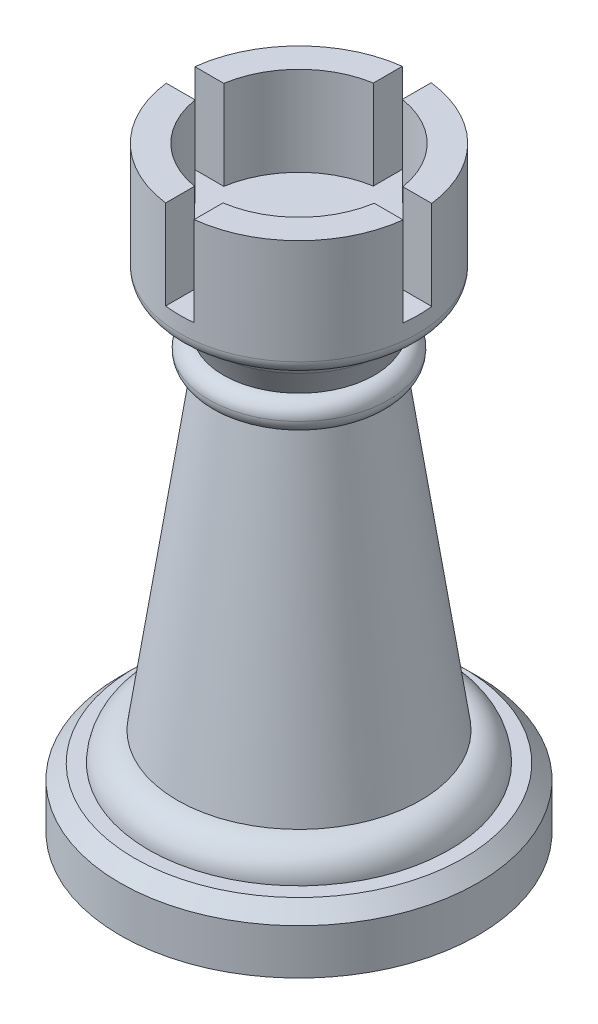
ISO-10303-21;
HEADER;
FILE_DESCRIPTION(('STEP AP214'),'2;1');
FILE_NAME('part.step','',(''),(''),'','','');
FILE_SCHEMA(('AUTOMOTIVE_DESIGN { 1 0 10303 214 1 1 1 1 }'));
ENDSEC;
DATA;
#1=APPLICATION_CONTEXT('core data for automotive mechanical design processes');
#2=APPLICATION_PROTOCOL_DEFINITION('international standard','automotive_design',2000,#1);
#3=PRODUCT_CONTEXT('',#1,'mechanical');
#4=PRODUCT('Part','Part','',(#3));
#5=PRODUCT_RELATED_PRODUCT_CATEGORY('part','',(#4));
#6=PRODUCT_DEFINITION_FORMATION('','',#4);
#7=PRODUCT_DEFINITION_CONTEXT('part definition',#1,'design');
#8=PRODUCT_DEFINITION('design','',#6,#7);
#9=PRODUCT_DEFINITION_SHAPE('','',#8);
#10=(LENGTH_UNIT() NAMED_UNIT(*) SI_UNIT(.MILLI.,.METRE.));
#11=(NAMED_UNIT(*) PLANE_ANGLE_UNIT() SI_UNIT($,.RADIAN.));
#12=(NAMED_UNIT(*) SI_UNIT($,.STERADIAN.) SOLID_ANGLE_UNIT());
#13=UNCERTAINTY_MEASURE_WITH_UNIT(LENGTH_MEASURE(1.E-05),#10,'distance_accuracy_value','');
#14=(GEOMETRIC_REPRESENTATION_CONTEXT(3) GLOBAL_UNCERTAINTY_ASSIGNED_CONTEXT((#13)) GLOBAL_UNIT_ASSIGNED_CONTEXT((#10,
#11,#12)) REPRESENTATION_CONTEXT('',''));
#15=CARTESIAN_POINT('',(0.,0.,0.));
#16=DIRECTION('',(0.,0.,1.));
#17=DIRECTION('',(1.,0.,0.));
#18=AXIS2_PLACEMENT_3D('',#15,#16,#17);
#19=CARTESIAN_POINT('',(-0.000284135877372561,24.6075293797934,0.));
#20=DIRECTION('',(0.,1.,0.));
#21=DIRECTION('',(0.,0.,1.));
#22=AXIS2_PLACEMENT_3D('',#19,#20,#21);
#23=PLANE('',#22);
#24=CARTESIAN_POINT('',(-0.000284135877372561,24.6075293797934,0.));
#25=DIRECTION('',(0.,1.,0.));
#26=DIRECTION('',(0.,0.,1.));
#27=AXIS2_PLACEMENT_3D('',#24,#25,#26);
#28=CIRCLE('',#27,7.5);
#29=CARTESIAN_POINT('',(7.44552005171714,24.6075293797934,-0.9));
#30=VERTEX_POINT('',#29);
#31=CARTESIAN_POINT('',(0.85583533168448,24.6075293797934,-7.45097708070972));
#32=VERTEX_POINT('',#31);
#33=EDGE_CURVE('E398',#30,#32,#28,.T.);
#34=ORIENTED_EDGE('',*,*,#33,.T.);
#35=DIRECTION('',(0.,0.,1.));
#36=VECTOR('',#35,1.);
#37=CARTESIAN_POINT('',(0.855835331684452,24.6075293797934,0.));
#38=LINE('',#37,#36);
#39=CARTESIAN_POINT('',(0.855835331684473,24.6075293797934,-5.63534022551093));
#40=VERTEX_POINT('',#39);
#41=EDGE_CURVE('E352',#32,#40,#38,.T.);
#42=ORIENTED_EDGE('',*,*,#41,.T.);
#43=CARTESIAN_POINT('',(-0.000284135877372561,24.6075293797934,0.));
#44=DIRECTION('',(0.,1.,0.));
#45=DIRECTION('',(0.,0.,1.));
#46=AXIS2_PLACEMENT_3D('',#43,#44,#45);
#47=CIRCLE('',#46,5.7);
#48=CARTESIAN_POINT('',(5.62821477591074,24.6075293797934,-0.9));
#49=VERTEX_POINT('',#48);
#50=EDGE_CURVE('E377',#49,#40,#47,.T.);
#51=ORIENTED_EDGE('',*,*,#50,.F.);
#52=DIRECTION('',(1.,0.,0.));
#53=VECTOR('',#52,1.);
#54=CARTESIAN_POINT('',(-0.000284135877372561,24.6075293797934,-0.9));
#55=LINE('',#54,#53);
#56=EDGE_CURVE('E329',#49,#30,#55,.T.);
#57=ORIENTED_EDGE('',*,*,#56,.T.);
#58=EDGE_LOOP('',(#34,#42,#51,#57));
#59=FACE_BOUND('',#58,.T.);
#60=ADVANCED_FACE('F170',(#59),#23,.T.);
#61=CARTESIAN_POINT('',(0.855835331684431,24.6075293797934,5.63534022551094));
#62=VERTEX_POINT('',#61);
#63=CARTESIAN_POINT('',(5.62821477591074,24.6075293797934,0.9));
#64=VERTEX_POINT('',#63);
#65=EDGE_CURVE('E374',#62,#64,#47,.T.);
#66=ORIENTED_EDGE('',*,*,#65,.F.);
#67=DIRECTION('',(0.,0.,1.));
#68=VECTOR('',#67,1.);
#69=CARTESIAN_POINT('',(0.855835331684452,24.6075293797934,0.));
#70=LINE('',#69,#68);
#71=CARTESIAN_POINT('',(0.855835331684424,24.6075293797934,7.45097708070973));
#72=VERTEX_POINT('',#71);
#73=EDGE_CURVE('E364',#62,#72,#70,.T.);
#74=ORIENTED_EDGE('',*,*,#73,.T.);
#75=CARTESIAN_POINT('',(7.44552005171714,24.6075293797934,0.9));
#76=VERTEX_POINT('',#75);
#77=EDGE_CURVE('E394',#72,#76,#28,.T.);
#78=ORIENTED_EDGE('',*,*,#77,.T.);
#79=DIRECTION('',(1.,0.,0.));
#80=VECTOR('',#79,1.);
#81=CARTESIAN_POINT('',(-0.000284135877372558,24.6075293797934,0.9));
#82=LINE('',#81,#80);
#83=EDGE_CURVE('E335',#64,#76,#82,.T.);
#84=ORIENTED_EDGE('',*,*,#83,.F.);
#85=EDGE_LOOP('',(#66,#74,#78,#84));
#86=FACE_BOUND('',#85,.T.);
#87=ADVANCED_FACE('F454',(#86),#23,.T.);
#88=CARTESIAN_POINT('',(-0.94416466831552,24.6075293797934,-7.44036891158525));
#89=VERTEX_POINT('',#88);
#90=CARTESIAN_POINT('',(-7.44608832347189,24.6075293797934,-0.9));
#91=VERTEX_POINT('',#90);
#92=EDGE_CURVE('E819',#89,#91,#28,.T.);
#93=ORIENTED_EDGE('',*,*,#92,.T.);
#94=DIRECTION('',(1.,0.,0.));
#95=VECTOR('',#94,1.);
#96=CARTESIAN_POINT('',(-0.000284135877372561,24.6075293797934,-0.9));
#97=LINE('',#96,#95);
#98=CARTESIAN_POINT('',(-5.62878304766549,24.6075293797934,-0.9));
#99=VERTEX_POINT('',#98);
#100=EDGE_CURVE('E312',#91,#99,#97,.T.);
#101=ORIENTED_EDGE('',*,*,#100,.T.);
#102=CARTESIAN_POINT('',(-0.944164668315527,24.6075293797934,-5.62130674669905));
#103=VERTEX_POINT('',#102);
#104=EDGE_CURVE('E289',#103,#99,#47,.T.);
#105=ORIENTED_EDGE('',*,*,#104,.F.);
#106=DIRECTION('',(0.,0.,1.));
#107=VECTOR('',#106,1.);
#108=CARTESIAN_POINT('',(-0.944164668315548,24.6075293797934,0.));
#109=LINE('',#108,#107);
#110=EDGE_CURVE('E349',#89,#103,#109,.T.);
#111=ORIENTED_EDGE('',*,*,#110,.F.);
#112=EDGE_LOOP('',(#93,#101,#105,#111));
#113=FACE_BOUND('',#112,.T.);
#114=ADVANCED_FACE('F456',(#113),#23,.T.);
#115=CARTESIAN_POINT('',(-0.000284135877372561,24.6075293797934,0.));
#116=DIRECTION('',(0.,1.,0.));
#117=DIRECTION('',(0.,0.,1.));
#118=AXIS2_PLACEMENT_3D('',#115,#116,#117);
#119=CYLINDRICAL_SURFACE('',#118,7.5);
#120=DIRECTION('',(0.,1.,0.));
#121=VECTOR('',#120,1.);
#122=CARTESIAN_POINT('',(-7.44608832347189,18.9975293797934,0.9));
#123=LINE('',#122,#121);
#124=CARTESIAN_POINT('',(-7.44608832347189,18.9975293797934,0.9));
#125=VERTEX_POINT('',#124);
#126=CARTESIAN_POINT('',(-7.44608832347189,24.6075293797934,0.9));
#127=VERTEX_POINT('',#126);
#128=EDGE_CURVE('E322',#125,#127,#123,.T.);
#129=ORIENTED_EDGE('',*,*,#128,.F.);
#130=CARTESIAN_POINT('',(-0.000284135877372561,18.9975293797934,0.));
#131=DIRECTION('',(0.,1.,0.));
#132=DIRECTION('',(0.,0.,1.));
#133=AXIS2_PLACEMENT_3D('',#130,#131,#132);
#134=CIRCLE('',#133,7.5);
#135=CARTESIAN_POINT('',(-7.44608832347189,18.9975293797934,-0.9));
#136=VERTEX_POINT('',#135);
#137=EDGE_CURVE('E307',#136,#125,#134,.T.);
#138=ORIENTED_EDGE('',*,*,#137,.F.);
#139=DIRECTION('',(0.,1.,0.));
#140=VECTOR('',#139,1.);
#141=CARTESIAN_POINT('',(-7.44608832347189,18.9975293797934,-0.9));
#142=LINE('',#141,#140);
#143=EDGE_CURVE('E293',#136,#91,#142,.T.);
#144=ORIENTED_EDGE('',*,*,#143,.T.);
#145=ORIENTED_EDGE('',*,*,#92,.F.);
#146=DIRECTION('',(0.,1.,0.));
#147=VECTOR('',#146,1.);
#148=CARTESIAN_POINT('',(-0.94416466831552,24.6075293797934,-7.44036891158525));
#149=LINE('',#148,#147);
#150=CARTESIAN_POINT('',(-0.94416466831552,18.9975293797934,-7.44036891158525));
#151=VERTEX_POINT('',#150);
#152=EDGE_CURVE('E422',#151,#89,#149,.T.);
#153=ORIENTED_EDGE('',*,*,#152,.F.);
#154=CARTESIAN_POINT('',(-0.000284135877372561,18.9975293797934,0.));
#155=DIRECTION('',(0.,1.,0.));
#156=DIRECTION('',(0.,0.,1.));
#157=AXIS2_PLACEMENT_3D('',#154,#155,#156);
#158=CIRCLE('',#157,7.5);
#159=CARTESIAN_POINT('',(0.85583533168448,18.9975293797934,-7.45097708070972));
#160=VERTEX_POINT('',#159);
#161=EDGE_CURVE('E424',#151,#160,#158,.F.);
#162=ORIENTED_EDGE('',*,*,#161,.T.);
#163=DIRECTION('',(0.,1.,0.));
#164=VECTOR('',#163,1.);
#165=CARTESIAN_POINT('',(0.85583533168448,24.6075293797934,-7.45097708070972));
#166=LINE('',#165,#164);
#167=EDGE_CURVE('E427',#160,#32,#166,.T.);
#168=ORIENTED_EDGE('',*,*,#167,.T.);
#169=ORIENTED_EDGE('',*,*,#33,.F.);
#170=DIRECTION('',(0.,1.,0.));
#171=VECTOR('',#170,1.);
#172=CARTESIAN_POINT('',(7.44552005171714,18.9975293797934,-0.9));
#173=LINE('',#172,#171);
#174=CARTESIAN_POINT('',(7.44552005171714,18.9975293797934,-0.9));
#175=VERTEX_POINT('',#174);
#176=EDGE_CURVE('E341',#175,#30,#173,.T.);
#177=ORIENTED_EDGE('',*,*,#176,.F.);
#178=CARTESIAN_POINT('',(-0.000284135877372561,18.9975293797934,0.));
#179=DIRECTION('',(0.,1.,0.));
#180=DIRECTION('',(0.,0.,1.));
#181=AXIS2_PLACEMENT_3D('',#178,#179,#180);
#182=CIRCLE('',#181,7.5);
#183=CARTESIAN_POINT('',(7.44552005171714,18.9975293797934,0.9));
#184=VERTEX_POINT('',#183);
#185=EDGE_CURVE('E328',#184,#175,#182,.T.);
#186=ORIENTED_EDGE('',*,*,#185,.F.);
#187=DIRECTION('',(0.,1.,0.));
#188=VECTOR('',#187,1.);
#189=CARTESIAN_POINT('',(7.44552005171714,18.9975293797934,0.9));
#190=LINE('',#189,#188);
#191=EDGE_CURVE('E343',#184,#76,#190,.T.);
#192=ORIENTED_EDGE('',*,*,#191,.T.);
#193=ORIENTED_EDGE('',*,*,#77,.F.);
#194=DIRECTION('',(0.,1.,0.));
#195=VECTOR('',#194,1.);
#196=CARTESIAN_POINT('',(0.855835331684424,24.6075293797934,7.45097708070973));
#197=LINE('',#196,#195);
#198=CARTESIAN_POINT('',(0.855835331684424,18.9975293797934,7.45097708070973));
#199=VERTEX_POINT('',#198);
#200=EDGE_CURVE('E12',#72,#199,#197,.F.);
#201=ORIENTED_EDGE('',*,*,#200,.T.);
#202=CARTESIAN_POINT('',(-0.944164668315575,18.9975293797934,7.44036891158524));
#203=VERTEX_POINT('',#202);
#204=EDGE_CURVE('E178',#199,#203,#158,.F.);
#205=ORIENTED_EDGE('',*,*,#204,.T.);
#206=DIRECTION('',(0.,1.,0.));
#207=VECTOR('',#206,1.);
#208=CARTESIAN_POINT('',(-0.944164668315575,24.6075293797934,7.44036891158524));
#209=LINE('',#208,#207);
#210=CARTESIAN_POINT('',(-0.944164668315575,24.6075293797934,7.44036891158524));
#211=VERTEX_POINT('',#210);
#212=EDGE_CURVE('E429',#211,#203,#209,.F.);
#213=ORIENTED_EDGE('',*,*,#212,.F.);
#214=EDGE_CURVE('E393',#127,#211,#28,.T.);
#215=ORIENTED_EDGE('',*,*,#214,.F.);
#216=EDGE_LOOP('',(#129,#138,#144,#145,#153,#162,#168,#169,#177,#186,#192,#193,#201,#205,#213,#215));
#217=FACE_BOUND('',#216,.T.);
#218=CARTESIAN_POINT('',(-0.000284135877372561,18.0075293797934,0.));
#219=DIRECTION('',(0.,1.,0.));
#220=DIRECTION('',(0.,0.,1.));
#221=AXIS2_PLACEMENT_3D('',#218,#219,#220);
#222=CIRCLE('',#221,7.5);
#223=CARTESIAN_POINT('',(-0.000284135877372561,18.0075293797934,7.5));
#224=VERTEX_POINT('',#223);
#225=EDGE_CURVE('E410',#224,#224,#222,.T.);
#226=ORIENTED_EDGE('',*,*,#225,.T.);
#227=EDGE_LOOP('',(#226));
#228=FACE_BOUND('',#227,.T.);
#229=ADVANCED_FACE('F436',(#217,#228),#119,.T.);
#230=DIRECTION('',(1.,0.,0.));
#231=VECTOR('',#230,1.);
#232=CARTESIAN_POINT('',(-0.000284135877372558,24.6075293797934,0.9));
#233=LINE('',#232,#231);
#234=CARTESIAN_POINT('',(-5.62878304766549,24.6075293797934,0.9));
#235=VERTEX_POINT('',#234);
#236=EDGE_CURVE('E308',#127,#235,#233,.T.);
#237=ORIENTED_EDGE('',*,*,#236,.F.);
#238=ORIENTED_EDGE('',*,*,#214,.T.);
#239=DIRECTION('',(0.,0.,1.));
#240=VECTOR('',#239,1.);
#241=CARTESIAN_POINT('',(-0.944164668315548,24.6075293797934,0.));
#242=LINE('',#241,#240);
#243=CARTESIAN_POINT('',(-0.944164668315569,24.6075293797934,5.62130674669904));
#244=VERTEX_POINT('',#243);
#245=EDGE_CURVE('E367',#244,#211,#242,.T.);
#246=ORIENTED_EDGE('',*,*,#245,.F.);
#247=EDGE_CURVE('E378',#235,#244,#47,.T.);
#248=ORIENTED_EDGE('',*,*,#247,.F.);
#249=EDGE_LOOP('',(#237,#238,#246,#248));
#250=FACE_BOUND('',#249,.T.);
#251=ADVANCED_FACE('F463',(#250),#23,.T.);
#252=CARTESIAN_POINT('',(-0.000284135877372561,16.2075293797934,0.));
#253=DIRECTION('',(0.,1.,0.));
#254=DIRECTION('',(0.,0.,1.));
#255=AXIS2_PLACEMENT_3D('',#252,#253,#254);
#256=CONICAL_SURFACE('',#255,5.7,0.476467419473706);
#257=CARTESIAN_POINT('',(-0.000284135877372561,16.0480018990106,0.));
#258=DIRECTION('',(0.,1.,0.));
#259=DIRECTION('',(0.,0.,1.));
#260=AXIS2_PLACEMENT_3D('',#257,#258,#259);
#261=CIRCLE('',#260,5.61766323572501);
#262=CARTESIAN_POINT('',(-0.000284135877372561,16.0480018990106,5.61766323572501));
#263=VERTEX_POINT('',#262);
#264=EDGE_CURVE('E419',#263,#263,#261,.F.);
#265=ORIENTED_EDGE('',*,*,#264,.T.);
#266=EDGE_LOOP('',(#265));
#267=FACE_BOUND('',#266,.T.);
#268=CARTESIAN_POINT('',(-0.000284135877372561,14.3475293797934,0.));
#269=DIRECTION('',(0.,1.,0.));
#270=DIRECTION('',(0.,0.,1.));
#271=AXIS2_PLACEMENT_3D('',#268,#269,#270);
#272=CIRCLE('',#271,4.74);
#273=CARTESIAN_POINT('',(-0.000284135877372561,14.3475293797934,4.74));
#274=VERTEX_POINT('',#273);
#275=EDGE_CURVE('E390',#274,#274,#272,.T.);
#276=ORIENTED_EDGE('',*,*,#275,.T.);
#277=EDGE_LOOP('',(#276));
#278=FACE_BOUND('',#277,.T.);
#279=ADVANCED_FACE('F468',(#267,#278),#256,.T.);
#280=CARTESIAN_POINT('',(-0.000284135877372561,24.6075293797934,0.));
#281=DIRECTION('',(0.,1.,0.));
#282=DIRECTION('',(0.,0.,1.));
#283=AXIS2_PLACEMENT_3D('',#280,#281,#282);
#284=CYLINDRICAL_SURFACE('',#283,5.64);
#285=CARTESIAN_POINT('',(-0.000284135877372561,13.4470292408273,0.));
#286=DIRECTION('',(0.,-1.,0.));
#287=DIRECTION('',(0.,0.,-1.));
#288=AXIS2_PLACEMENT_3D('',#285,#286,#287);
#289=CIRCLE('',#288,5.64);
#290=CARTESIAN_POINT('',(-0.000284135877372561,13.4470292408273,-5.64));
#291=VERTEX_POINT('',#290);
#292=EDGE_CURVE('E407',#291,#291,#289,.F.);
#293=ORIENTED_EDGE('',*,*,#292,.T.);
#294=EDGE_LOOP('',(#293));
#295=FACE_BOUND('',#294,.T.);
#296=CARTESIAN_POINT('',(-0.000284135877372561,13.4475293797934,0.));
#297=DIRECTION('',(0.,1.,0.));
#298=DIRECTION('',(0.,0.,1.));
#299=AXIS2_PLACEMENT_3D('',#296,#297,#298);
#300=CIRCLE('',#299,5.64);
#301=CARTESIAN_POINT('',(-0.000284135877372561,13.4475293797934,5.64));
#302=VERTEX_POINT('',#301);
#303=EDGE_CURVE('E404',#302,#302,#300,.F.);
#304=ORIENTED_EDGE('',*,*,#303,.T.);
#305=EDGE_LOOP('',(#304));
#306=FACE_BOUND('',#305,.T.);
#307=ADVANCED_FACE('F519',(#295,#306),#284,.T.);
#308=CARTESIAN_POINT('',(-0.000284135877372561,-7.34247062020662,0.));
#309=DIRECTION('',(0.,-1.,0.));
#310=DIRECTION('',(0.,0.,-1.));
#311=AXIS2_PLACEMENT_3D('',#308,#309,#310);
#312=CONICAL_SURFACE('',#311,7.65,0.143796988986842);
#313=CARTESIAN_POINT('',(-0.000284135877372561,12.5475293797934,0.));
#314=DIRECTION('',(0.,1.,0.));
#315=DIRECTION('',(0.,0.,1.));
#316=AXIS2_PLACEMENT_3D('',#313,#314,#315);
#317=CIRCLE('',#316,4.77);
#318=CARTESIAN_POINT('',(-0.000284135877372561,12.5475293797934,4.77));
#319=VERTEX_POINT('',#318);
#320=EDGE_CURVE('E387',#319,#319,#317,.T.);
#321=ORIENTED_EDGE('',*,*,#320,.F.);
#322=EDGE_LOOP('',(#321));
#323=FACE_BOUND('',#322,.T.);
#324=CARTESIAN_POINT('',(-0.000284135877372561,-7.34247062020662,0.));
#325=DIRECTION('',(0.,1.,0.));
#326=DIRECTION('',(0.,0.,1.));
#327=AXIS2_PLACEMENT_3D('',#324,#325,#326);
#328=CIRCLE('',#327,7.65);
#329=CARTESIAN_POINT('',(-0.000284135877372561,-7.34247062020662,7.65));
#330=VERTEX_POINT('',#329);
#331=EDGE_CURVE('E384',#330,#330,#328,.T.);
#332=ORIENTED_EDGE('',*,*,#331,.T.);
#333=EDGE_LOOP('',(#332));
#334=FACE_BOUND('',#333,.T.);
#335=ADVANCED_FACE('F526',(#323,#334),#312,.T.);
#336=CARTESIAN_POINT('',(-0.000284135877372561,-9.14247062020662,0.));
#337=DIRECTION('',(0.,1.,0.));
#338=DIRECTION('',(0.,0.,1.));
#339=AXIS2_PLACEMENT_3D('',#336,#337,#338);
#340=PLANE('',#339);
#341=CARTESIAN_POINT('',(-0.000284135877372561,-9.14247062020662,0.));
#342=DIRECTION('',(0.,1.,0.));
#343=DIRECTION('',(0.,0.,1.));
#344=AXIS2_PLACEMENT_3D('',#341,#342,#343);
#345=CIRCLE('',#344,10.35);
#346=CARTESIAN_POINT('',(-0.000284135877372561,-9.14247062020662,10.35));
#347=VERTEX_POINT('',#346);
#348=EDGE_CURVE('E397',#347,#347,#345,.T.);
#349=ORIENTED_EDGE('',*,*,#348,.T.);
#350=EDGE_LOOP('',(#349));
#351=FACE_BOUND('',#350,.T.);
#352=CARTESIAN_POINT('',(-0.000284135877372561,-9.14247062020662,0.));
#353=DIRECTION('',(0.,1.,0.));
#354=DIRECTION('',(0.,0.,1.));
#355=AXIS2_PLACEMENT_3D('',#352,#353,#354);
#356=CIRCLE('',#355,9.45);
#357=CARTESIAN_POINT('',(-0.000284135877372561,-9.14247062020662,9.45));
#358=VERTEX_POINT('',#357);
#359=EDGE_CURVE('E381',#358,#358,#356,.T.);
#360=ORIENTED_EDGE('',*,*,#359,.F.);
#361=EDGE_LOOP('',(#360));
#362=FACE_BOUND('',#361,.T.);
#363=ADVANCED_FACE('F534',(#351,#362),#340,.T.);
#364=CARTESIAN_POINT('',(-0.000284135877372561,24.6075293797934,0.));
#365=DIRECTION('',(0.,1.,0.));
#366=DIRECTION('',(0.,0.,1.));
#367=AXIS2_PLACEMENT_3D('',#364,#365,#366);
#368=CYLINDRICAL_SURFACE('',#367,11.25);
#369=CARTESIAN_POINT('',(-0.000284135877372561,-10.0424706202066,0.));
#370=DIRECTION('',(0.,1.,0.));
#371=DIRECTION('',(0.,0.,1.));
#372=AXIS2_PLACEMENT_3D('',#369,#370,#371);
#373=CIRCLE('',#372,11.25);
#374=CARTESIAN_POINT('',(-0.000284135877372561,-10.0424706202066,11.25));
#375=VERTEX_POINT('',#374);
#376=EDGE_CURVE('E401',#375,#375,#373,.F.);
#377=ORIENTED_EDGE('',*,*,#376,.T.);
#378=EDGE_LOOP('',(#377));
#379=FACE_BOUND('',#378,.T.);
#380=CARTESIAN_POINT('',(-0.000284135877372561,-12.8924706202066,0.));
#381=DIRECTION('',(0.,1.,0.));
#382=DIRECTION('',(0.,0.,1.));
#383=AXIS2_PLACEMENT_3D('',#380,#381,#382);
#384=CIRCLE('',#383,11.25);
#385=CARTESIAN_POINT('',(-0.000284135877372561,-12.8924706202066,11.25));
#386=VERTEX_POINT('',#385);
#387=EDGE_CURVE('E321',#386,#386,#384,.T.);
#388=ORIENTED_EDGE('',*,*,#387,.T.);
#389=EDGE_LOOP('',(#388));
#390=FACE_BOUND('',#389,.T.);
#391=ADVANCED_FACE('F542',(#379,#390),#368,.T.);
#392=CARTESIAN_POINT('',(-0.000284135877372561,-12.8924706202066,0.));
#393=DIRECTION('',(0.,1.,0.));
#394=DIRECTION('',(0.,0.,1.));
#395=AXIS2_PLACEMENT_3D('',#392,#393,#394);
#396=PLANE('',#395);
#397=ORIENTED_EDGE('',*,*,#387,.F.);
#398=EDGE_LOOP('',(#397));
#399=FACE_BOUND('',#398,.T.);
#400=ADVANCED_FACE('F475',(#399),#396,.F.);
#401=CARTESIAN_POINT('',(-0.000284135877372561,-9.14247062020662,0.));
#402=DIRECTION('',(0.,-1.,0.));
#403=DIRECTION('',(0.,0.,-1.));
#404=AXIS2_PLACEMENT_3D('',#401,#402,#403);
#405=CONICAL_SURFACE('',#404,10.35,0.78539816339745);
#406=ORIENTED_EDGE('',*,*,#376,.F.);
#407=EDGE_LOOP('',(#406));
#408=FACE_BOUND('',#407,.T.);
#409=ORIENTED_EDGE('',*,*,#348,.F.);
#410=EDGE_LOOP('',(#409));
#411=FACE_BOUND('',#410,.T.);
#412=ADVANCED_FACE('F471',(#408,#411),#405,.T.);
#413=CARTESIAN_POINT('',(-0.000284135877372561,-9.14247062020662,0.));
#414=DIRECTION('',(0.,1.,0.));
#415=DIRECTION('',(0.,0.,1.));
#416=AXIS2_PLACEMENT_3D('',#413,#414,#415);
#417=TOROIDAL_SURFACE('',#416,7.65,1.8);
#418=ORIENTED_EDGE('',*,*,#359,.T.);
#419=EDGE_LOOP('',(#418));
#420=FACE_BOUND('',#419,.T.);
#421=ORIENTED_EDGE('',*,*,#331,.F.);
#422=EDGE_LOOP('',(#421));
#423=FACE_BOUND('',#422,.T.);
#424=ADVANCED_FACE('F474',(#420,#423),#417,.T.);
#425=CARTESIAN_POINT('',(-0.000284135877372561,13.4470292408273,0.));
#426=DIRECTION('',(0.,-1.,0.));
#427=DIRECTION('',(0.,0.,-1.));
#428=AXIS2_PLACEMENT_3D('',#425,#426,#427);
#429=TOROIDAL_SURFACE('',#428,4.74,0.9);
#430=ORIENTED_EDGE('',*,*,#320,.T.);
#431=EDGE_LOOP('',(#430));
#432=FACE_BOUND('',#431,.T.);
#433=ORIENTED_EDGE('',*,*,#292,.F.);
#434=EDGE_LOOP('',(#433));
#435=FACE_BOUND('',#434,.T.);
#436=ADVANCED_FACE('F479',(#432,#435),#429,.T.);
#437=CARTESIAN_POINT('',(-0.000284135877372561,13.4475293797934,0.));
#438=DIRECTION('',(0.,1.,0.));
#439=DIRECTION('',(0.,0.,1.));
#440=AXIS2_PLACEMENT_3D('',#437,#438,#439);
#441=TOROIDAL_SURFACE('',#440,4.74,0.9);
#442=ORIENTED_EDGE('',*,*,#303,.F.);
#443=EDGE_LOOP('',(#442));
#444=FACE_BOUND('',#443,.T.);
#445=ORIENTED_EDGE('',*,*,#275,.F.);
#446=EDGE_LOOP('',(#445));
#447=FACE_BOUND('',#446,.T.);
#448=ADVANCED_FACE('F483',(#444,#447),#441,.T.);
#449=CARTESIAN_POINT('',(-0.000284135877372561,18.0075293797934,0.));
#450=DIRECTION('',(0.,1.,0.));
#451=DIRECTION('',(0.,0.,1.));
#452=AXIS2_PLACEMENT_3D('',#449,#450,#451);
#453=TOROIDAL_SURFACE('',#452,6.6,0.9);
#454=CARTESIAN_POINT('',(-0.000284135877372561,17.1075293797934,0.));
#455=DIRECTION('',(0.,1.,0.));
#456=DIRECTION('',(0.,0.,1.));
#457=AXIS2_PLACEMENT_3D('',#454,#455,#456);
#458=CIRCLE('',#457,6.6);
#459=CARTESIAN_POINT('',(-0.000284135877372561,17.1075293797934,6.6));
#460=VERTEX_POINT('',#459);
#461=EDGE_CURVE('E413',#460,#460,#458,.F.);
#462=ORIENTED_EDGE('',*,*,#461,.F.);
#463=EDGE_LOOP('',(#462));
#464=FACE_BOUND('',#463,.T.);
#465=ORIENTED_EDGE('',*,*,#225,.F.);
#466=EDGE_LOOP('',(#465));
#467=FACE_BOUND('',#466,.T.);
#468=ADVANCED_FACE('F487',(#464,#467),#453,.T.);
#469=CARTESIAN_POINT('',(-0.000284135877372561,16.2075293797934,0.));
#470=DIRECTION('',(0.,1.,0.));
#471=DIRECTION('',(0.,0.,1.));
#472=AXIS2_PLACEMENT_3D('',#469,#470,#471);
#473=TOROIDAL_SURFACE('',#472,6.6,0.9);
#474=CARTESIAN_POINT('',(-0.000284135877372561,16.3341549532986,0.));
#475=DIRECTION('',(0.,-1.,0.));
#476=DIRECTION('',(0.,0.,-1.));
#477=AXIS2_PLACEMENT_3D('',#474,#475,#476);
#478=CIRCLE('',#477,5.70895232218782);
#479=CARTESIAN_POINT('',(-0.000284135877372561,16.3341549532986,-5.70895232218782));
#480=VERTEX_POINT('',#479);
#481=EDGE_CURVE('E416',#480,#480,#478,.F.);
#482=ORIENTED_EDGE('',*,*,#481,.T.);
#483=EDGE_LOOP('',(#482));
#484=FACE_BOUND('',#483,.T.);
#485=ORIENTED_EDGE('',*,*,#461,.T.);
#486=EDGE_LOOP('',(#485));
#487=FACE_BOUND('',#486,.T.);
#488=ADVANCED_FACE('F490',(#484,#487),#473,.F.);
#489=CARTESIAN_POINT('',(-0.000284135877372561,16.4607805268038,0.));
#490=DIRECTION('',(0.,1.,0.));
#491=DIRECTION('',(0.,0.,1.));
#492=AXIS2_PLACEMENT_3D('',#489,#490,#491);
#493=TOROIDAL_SURFACE('',#492,4.81790464437564,0.9);
#494=ORIENTED_EDGE('',*,*,#264,.F.);
#495=EDGE_LOOP('',(#494));
#496=FACE_BOUND('',#495,.T.);
#497=ORIENTED_EDGE('',*,*,#481,.F.);
#498=EDGE_LOOP('',(#497));
#499=FACE_BOUND('',#498,.T.);
#500=ADVANCED_FACE('F172',(#496,#499),#493,.T.);
#501=CARTESIAN_POINT('',(-0.000284135877372558,18.9975293797934,0.9));
#502=DIRECTION('',(0.,0.,1.));
#503=DIRECTION('',(1.,0.,0.));
#504=AXIS2_PLACEMENT_3D('',#501,#502,#503);
#505=PLANE('',#504);
#506=ORIENTED_EDGE('',*,*,#236,.T.);
#507=DIRECTION('',(0.,1.,0.));
#508=VECTOR('',#507,1.);
#509=CARTESIAN_POINT('',(-5.62878304766549,18.9975293797934,0.9));
#510=LINE('',#509,#508);
#511=CARTESIAN_POINT('',(-5.62878304766549,18.9975293797934,0.9));
#512=VERTEX_POINT('',#511);
#513=EDGE_CURVE('E319',#512,#235,#510,.T.);
#514=ORIENTED_EDGE('',*,*,#513,.F.);
#515=DIRECTION('',(1.,0.,0.));
#516=VECTOR('',#515,1.);
#517=CARTESIAN_POINT('',(-0.000284135877372558,18.9975293797934,0.9));
#518=LINE('',#517,#516);
#519=EDGE_CURVE('E294',#125,#512,#518,.T.);
#520=ORIENTED_EDGE('',*,*,#519,.F.);
#521=ORIENTED_EDGE('',*,*,#128,.T.);
#522=EDGE_LOOP('',(#506,#514,#520,#521));
#523=FACE_BOUND('',#522,.T.);
#524=ADVANCED_FACE('F497',(#523),#505,.F.);
#525=CARTESIAN_POINT('',(-0.000284135877372561,18.9975293797934,-0.9));
#526=DIRECTION('',(0.,0.,1.));
#527=DIRECTION('',(1.,0.,0.));
#528=AXIS2_PLACEMENT_3D('',#525,#526,#527);
#529=PLANE('',#528);
#530=ORIENTED_EDGE('',*,*,#100,.F.);
#531=ORIENTED_EDGE('',*,*,#143,.F.);
#532=DIRECTION('',(1.,0.,0.));
#533=VECTOR('',#532,1.);
#534=CARTESIAN_POINT('',(-0.000284135877372561,18.9975293797934,-0.9));
#535=LINE('',#534,#533);
#536=CARTESIAN_POINT('',(-5.62878304766549,18.9975293797934,-0.9));
#537=VERTEX_POINT('',#536);
#538=EDGE_CURVE('E299',#136,#537,#535,.T.);
#539=ORIENTED_EDGE('',*,*,#538,.T.);
#540=DIRECTION('',(0.,1.,0.));
#541=VECTOR('',#540,1.);
#542=CARTESIAN_POINT('',(-5.62878304766549,18.9975293797934,-0.9));
#543=LINE('',#542,#541);
#544=EDGE_CURVE('E283',#537,#99,#543,.T.);
#545=ORIENTED_EDGE('',*,*,#544,.T.);
#546=EDGE_LOOP('',(#530,#531,#539,#545));
#547=FACE_BOUND('',#546,.T.);
#548=ADVANCED_FACE('F305',(#547),#529,.T.);
#549=CARTESIAN_POINT('',(-0.000284135877372561,18.9975293797934,0.));
#550=DIRECTION('',(0.,1.,0.));
#551=DIRECTION('',(0.,0.,1.));
#552=AXIS2_PLACEMENT_3D('',#549,#550,#551);
#553=PLANE('',#552);
#554=DIRECTION('',(0.,0.,1.));
#555=VECTOR('',#554,1.);
#556=CARTESIAN_POINT('',(-0.944164668315548,18.9975293797934,0.));
#557=LINE('',#556,#555);
#558=CARTESIAN_POINT('',(-0.944164668315527,18.9975293797934,-5.62130674669905));
#559=VERTEX_POINT('',#558);
#560=EDGE_CURVE('E185',#151,#559,#557,.T.);
#561=ORIENTED_EDGE('',*,*,#560,.T.);
#562=CARTESIAN_POINT('',(-0.000284135877372561,18.9975293797934,0.));
#563=DIRECTION('',(0.,1.,0.));
#564=DIRECTION('',(0.,0.,1.));
#565=AXIS2_PLACEMENT_3D('',#562,#563,#564);
#566=CIRCLE('',#565,5.7);
#567=EDGE_CURVE('E287',#559,#537,#566,.T.);
#568=ORIENTED_EDGE('',*,*,#567,.T.);
#569=ORIENTED_EDGE('',*,*,#538,.F.);
#570=ORIENTED_EDGE('',*,*,#137,.T.);
#571=ORIENTED_EDGE('',*,*,#519,.T.);
#572=CARTESIAN_POINT('',(-0.944164668315569,18.9975293797934,5.62130674669904));
#573=VERTEX_POINT('',#572);
#574=EDGE_CURVE('E302',#512,#573,#566,.T.);
#575=ORIENTED_EDGE('',*,*,#574,.T.);
#576=DIRECTION('',(0.,0.,1.));
#577=VECTOR('',#576,1.);
#578=CARTESIAN_POINT('',(-0.944164668315548,18.9975293797934,0.));
#579=LINE('',#578,#577);
#580=EDGE_CURVE('E360',#573,#203,#579,.T.);
#581=ORIENTED_EDGE('',*,*,#580,.T.);
#582=ORIENTED_EDGE('',*,*,#204,.F.);
#583=DIRECTION('',(0.,0.,1.));
#584=VECTOR('',#583,1.);
#585=CARTESIAN_POINT('',(0.855835331684452,18.9975293797934,0.));
#586=LINE('',#585,#584);
#587=CARTESIAN_POINT('',(0.855835331684431,18.9975293797934,5.63534022551094));
#588=VERTEX_POINT('',#587);
#589=EDGE_CURVE('E363',#588,#199,#586,.T.);
#590=ORIENTED_EDGE('',*,*,#589,.F.);
#591=CARTESIAN_POINT('',(5.62821477591074,18.9975293797934,0.9));
#592=VERTEX_POINT('',#591);
#593=EDGE_CURVE('E304',#588,#592,#566,.T.);
#594=ORIENTED_EDGE('',*,*,#593,.T.);
#595=DIRECTION('',(1.,0.,0.));
#596=VECTOR('',#595,1.);
#597=CARTESIAN_POINT('',(-0.000284135877372558,18.9975293797934,0.9));
#598=LINE('',#597,#596);
#599=EDGE_CURVE('E325',#592,#184,#598,.T.);
#600=ORIENTED_EDGE('',*,*,#599,.T.);
#601=ORIENTED_EDGE('',*,*,#185,.T.);
#602=DIRECTION('',(1.,0.,0.));
#603=VECTOR('',#602,1.);
#604=CARTESIAN_POINT('',(-0.000284135877372561,18.9975293797934,-0.9));
#605=LINE('',#604,#603);
#606=CARTESIAN_POINT('',(5.62821477591074,18.9975293797934,-0.9));
#607=VERTEX_POINT('',#606);
#608=EDGE_CURVE('E332',#607,#175,#605,.T.);
#609=ORIENTED_EDGE('',*,*,#608,.F.);
#610=CARTESIAN_POINT('',(0.855835331684473,18.9975293797934,-5.63534022551093));
#611=VERTEX_POINT('',#610);
#612=EDGE_CURVE('E301',#607,#611,#566,.T.);
#613=ORIENTED_EDGE('',*,*,#612,.T.);
#614=DIRECTION('',(0.,0.,1.));
#615=VECTOR('',#614,1.);
#616=CARTESIAN_POINT('',(0.855835331684452,18.9975293797934,0.));
#617=LINE('',#616,#615);
#618=EDGE_CURVE('E347',#160,#611,#617,.T.);
#619=ORIENTED_EDGE('',*,*,#618,.F.);
#620=ORIENTED_EDGE('',*,*,#161,.F.);
#621=EDGE_LOOP('',(#561,#568,#569,#570,#571,#575,#581,#582,#590,#594,#600,#601,#609,#613,#619,#620));
#622=FACE_BOUND('',#621,.T.);
#623=ADVANCED_FACE('F298',(#622),#553,.T.);
#624=CARTESIAN_POINT('',(0.855835331684514,18.9975293797934,-16.4431792820926));
#625=DIRECTION('',(-1.,0.,0.));
#626=DIRECTION('',(0.,0.,1.));
#627=AXIS2_PLACEMENT_3D('',#624,#625,#626);
#628=PLANE('',#627);
#629=ORIENTED_EDGE('',*,*,#73,.F.);
#630=DIRECTION('',(0.,1.,0.));
#631=VECTOR('',#630,1.);
#632=CARTESIAN_POINT('',(0.855835331684431,18.9975293797934,5.63534022551094));
#633=LINE('',#632,#631);
#634=EDGE_CURVE('E355',#588,#62,#633,.T.);
#635=ORIENTED_EDGE('',*,*,#634,.F.);
#636=ORIENTED_EDGE('',*,*,#589,.T.);
#637=ORIENTED_EDGE('',*,*,#200,.F.);
#638=EDGE_LOOP('',(#629,#635,#636,#637));
#639=FACE_BOUND('',#638,.T.);
#640=ADVANCED_FACE('F442',(#639),#628,.T.);
#641=ORIENTED_EDGE('',*,*,#618,.T.);
#642=DIRECTION('',(0.,1.,0.));
#643=VECTOR('',#642,1.);
#644=CARTESIAN_POINT('',(0.855835331684473,18.9975293797934,-5.63534022551093));
#645=LINE('',#644,#643);
#646=EDGE_CURVE('E351',#611,#40,#645,.T.);
#647=ORIENTED_EDGE('',*,*,#646,.T.);
#648=ORIENTED_EDGE('',*,*,#41,.F.);
#649=ORIENTED_EDGE('',*,*,#167,.F.);
#650=EDGE_LOOP('',(#641,#647,#648,#649));
#651=FACE_BOUND('',#650,.T.);
#652=ADVANCED_FACE('F622',(#651),#628,.T.);
#653=CARTESIAN_POINT('',(-0.000284135877372561,18.9975293797934,-0.9));
#654=DIRECTION('',(0.,0.,1.));
#655=DIRECTION('',(1.,0.,0.));
#656=AXIS2_PLACEMENT_3D('',#653,#654,#655);
#657=PLANE('',#656);
#658=ORIENTED_EDGE('',*,*,#56,.F.);
#659=DIRECTION('',(0.,1.,0.));
#660=VECTOR('',#659,1.);
#661=CARTESIAN_POINT('',(5.62821477591074,18.9975293797934,-0.9));
#662=LINE('',#661,#660);
#663=EDGE_CURVE('E317',#607,#49,#662,.T.);
#664=ORIENTED_EDGE('',*,*,#663,.F.);
#665=ORIENTED_EDGE('',*,*,#608,.T.);
#666=ORIENTED_EDGE('',*,*,#176,.T.);
#667=EDGE_LOOP('',(#658,#664,#665,#666));
#668=FACE_BOUND('',#667,.T.);
#669=ADVANCED_FACE('F632',(#668),#657,.T.);
#670=CARTESIAN_POINT('',(-0.000284135877372558,18.9975293797934,0.9));
#671=DIRECTION('',(0.,0.,1.));
#672=DIRECTION('',(1.,0.,0.));
#673=AXIS2_PLACEMENT_3D('',#670,#671,#672);
#674=PLANE('',#673);
#675=ORIENTED_EDGE('',*,*,#83,.T.);
#676=ORIENTED_EDGE('',*,*,#191,.F.);
#677=ORIENTED_EDGE('',*,*,#599,.F.);
#678=DIRECTION('',(0.,1.,0.));
#679=VECTOR('',#678,1.);
#680=CARTESIAN_POINT('',(5.62821477591074,18.9975293797934,0.9));
#681=LINE('',#680,#679);
#682=EDGE_CURVE('E334',#592,#64,#681,.T.);
#683=ORIENTED_EDGE('',*,*,#682,.T.);
#684=EDGE_LOOP('',(#675,#676,#677,#683));
#685=FACE_BOUND('',#684,.T.);
#686=ADVANCED_FACE('F450',(#685),#674,.F.);
#687=CARTESIAN_POINT('',(-0.000284135877372561,18.9975293797934,0.));
#688=DIRECTION('',(0.,1.,0.));
#689=DIRECTION('',(0.,0.,1.));
#690=AXIS2_PLACEMENT_3D('',#687,#688,#689);
#691=CYLINDRICAL_SURFACE('',#690,5.7);
#692=ORIENTED_EDGE('',*,*,#663,.T.);
#693=ORIENTED_EDGE('',*,*,#50,.T.);
#694=ORIENTED_EDGE('',*,*,#646,.F.);
#695=ORIENTED_EDGE('',*,*,#612,.F.);
#696=EDGE_LOOP('',(#692,#693,#694,#695));
#697=FACE_BOUND('',#696,.T.);
#698=ADVANCED_FACE('F651',(#697),#691,.F.);
#699=ORIENTED_EDGE('',*,*,#593,.F.);
#700=ORIENTED_EDGE('',*,*,#634,.T.);
#701=ORIENTED_EDGE('',*,*,#65,.T.);
#702=ORIENTED_EDGE('',*,*,#682,.F.);
#703=EDGE_LOOP('',(#699,#700,#701,#702));
#704=FACE_BOUND('',#703,.T.);
#705=ADVANCED_FACE('F446',(#704),#691,.F.);
#706=CARTESIAN_POINT('',(-0.944164668315486,18.9975293797934,-16.4431792820927));
#707=DIRECTION('',(-1.,0.,0.));
#708=DIRECTION('',(0.,0.,1.));
#709=AXIS2_PLACEMENT_3D('',#706,#707,#708);
#710=PLANE('',#709);
#711=ORIENTED_EDGE('',*,*,#212,.T.);
#712=ORIENTED_EDGE('',*,*,#580,.F.);
#713=DIRECTION('',(0.,1.,0.));
#714=VECTOR('',#713,1.);
#715=CARTESIAN_POINT('',(-0.944164668315569,18.9975293797934,5.62130674669904));
#716=LINE('',#715,#714);
#717=EDGE_CURVE('E366',#573,#244,#716,.T.);
#718=ORIENTED_EDGE('',*,*,#717,.T.);
#719=ORIENTED_EDGE('',*,*,#245,.T.);
#720=EDGE_LOOP('',(#711,#712,#718,#719));
#721=FACE_BOUND('',#720,.T.);
#722=ADVANCED_FACE('F624',(#721),#710,.F.);
#723=ORIENTED_EDGE('',*,*,#152,.T.);
#724=ORIENTED_EDGE('',*,*,#110,.T.);
#725=DIRECTION('',(0.,1.,0.));
#726=VECTOR('',#725,1.);
#727=CARTESIAN_POINT('',(-0.944164668315527,18.9975293797934,-5.62130674669905));
#728=LINE('',#727,#726);
#729=EDGE_CURVE('E337',#559,#103,#728,.T.);
#730=ORIENTED_EDGE('',*,*,#729,.F.);
#731=ORIENTED_EDGE('',*,*,#560,.F.);
#732=EDGE_LOOP('',(#723,#724,#730,#731));
#733=FACE_BOUND('',#732,.T.);
#734=ADVANCED_FACE('F634',(#733),#710,.F.);
#735=ORIENTED_EDGE('',*,*,#247,.T.);
#736=ORIENTED_EDGE('',*,*,#717,.F.);
#737=ORIENTED_EDGE('',*,*,#574,.F.);
#738=ORIENTED_EDGE('',*,*,#513,.T.);
#739=EDGE_LOOP('',(#735,#736,#737,#738));
#740=FACE_BOUND('',#739,.T.);
#741=ADVANCED_FACE('F669',(#740),#691,.F.);
#742=ORIENTED_EDGE('',*,*,#544,.F.);
#743=ORIENTED_EDGE('',*,*,#567,.F.);
#744=ORIENTED_EDGE('',*,*,#729,.T.);
#745=ORIENTED_EDGE('',*,*,#104,.T.);
#746=EDGE_LOOP('',(#742,#743,#744,#745));
#747=FACE_BOUND('',#746,.T.);
#748=ADVANCED_FACE('F285',(#747),#691,.F.);
#749=CLOSED_SHELL('',(#60,#87,#114,#229,#251,#279,#307,#335,#363,#391,#400,#412,#424,#436,#448,
#468,#488,#500,#524,#548,#623,#640,#652,#669,#686,#698,#705,#722,#734,#741,#748));
#750=MANIFOLD_SOLID_BREP('B2',#749);
#751=ADVANCED_BREP_SHAPE_REPRESENTATION('',(#18,#750),#14);
#752=SHAPE_DEFINITION_REPRESENTATION(#9,#751);
ENDSEC;
END-ISO-10303-21;
